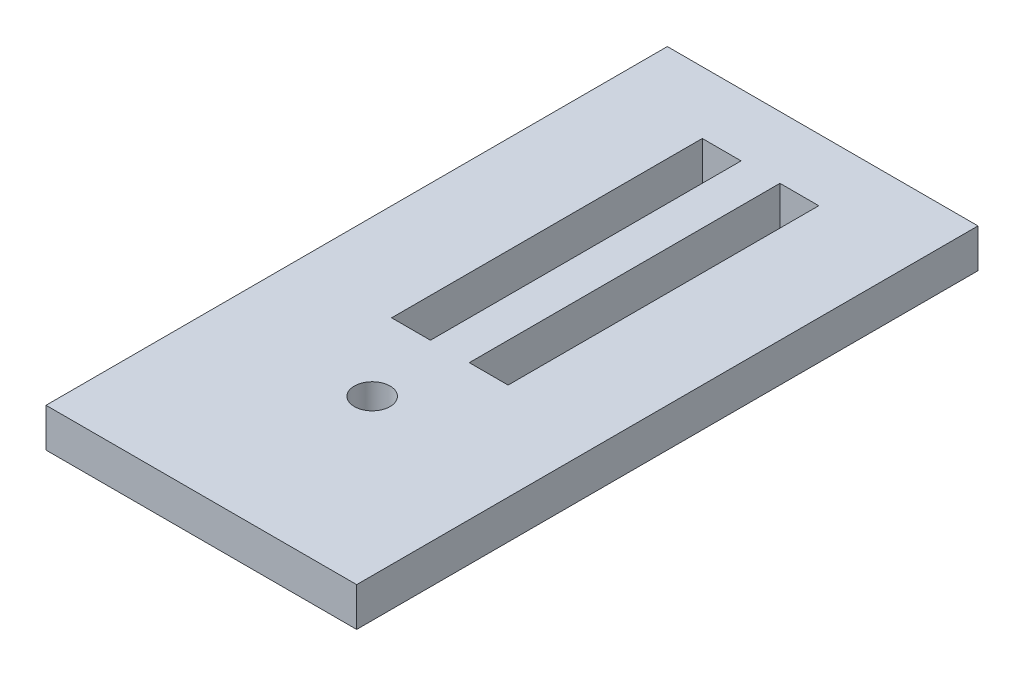
ISO-10303-21;
HEADER;
FILE_DESCRIPTION(('STEP AP214'),'2;1');
FILE_NAME('part.step','',(''),(''),'','','');
FILE_SCHEMA(('AUTOMOTIVE_DESIGN { 1 0 10303 214 1 1 1 1 }'));
ENDSEC;
DATA;
#1=APPLICATION_CONTEXT('core data for automotive mechanical design processes');
#2=APPLICATION_PROTOCOL_DEFINITION('international standard','automotive_design',2000,#1);
#3=PRODUCT_CONTEXT('',#1,'mechanical');
#4=PRODUCT('Part','Part','',(#3));
#5=PRODUCT_RELATED_PRODUCT_CATEGORY('part','',(#4));
#6=PRODUCT_DEFINITION_FORMATION('','',#4);
#7=PRODUCT_DEFINITION_CONTEXT('part definition',#1,'design');
#8=PRODUCT_DEFINITION('design','',#6,#7);
#9=PRODUCT_DEFINITION_SHAPE('','',#8);
#10=(LENGTH_UNIT() NAMED_UNIT(*) SI_UNIT(.MILLI.,.METRE.));
#11=(NAMED_UNIT(*) PLANE_ANGLE_UNIT() SI_UNIT($,.RADIAN.));
#12=(NAMED_UNIT(*) SI_UNIT($,.STERADIAN.) SOLID_ANGLE_UNIT());
#13=UNCERTAINTY_MEASURE_WITH_UNIT(LENGTH_MEASURE(1.E-05),#10,'distance_accuracy_value','');
#14=(GEOMETRIC_REPRESENTATION_CONTEXT(3) GLOBAL_UNCERTAINTY_ASSIGNED_CONTEXT((#13)) GLOBAL_UNIT_ASSIGNED_CONTEXT((#10,
#11,#12)) REPRESENTATION_CONTEXT('',''));
#15=CARTESIAN_POINT('',(0.,0.,0.));
#16=DIRECTION('',(0.,0.,1.));
#17=DIRECTION('',(1.,0.,0.));
#18=AXIS2_PLACEMENT_3D('',#15,#16,#17);
#19=CARTESIAN_POINT('',(0.,3.175,0.));
#20=DIRECTION('',(0.,-1.,0.));
#21=DIRECTION('',(0.,0.,-1.));
#22=AXIS2_PLACEMENT_3D('',#19,#20,#21);
#23=PLANE('',#22);
#24=DIRECTION('',(0.,0.,-1.));
#25=VECTOR('',#24,1.);
#26=CARTESIAN_POINT('',(11.1125,3.175,-45.72));
#27=LINE('',#26,#25);
#28=CARTESIAN_POINT('',(11.1125,3.175,-20.32));
#29=VERTEX_POINT('',#28);
#30=CARTESIAN_POINT('',(11.1125,3.175,-45.72));
#31=VERTEX_POINT('',#30);
#32=EDGE_CURVE('E186',#29,#31,#27,.T.);
#33=ORIENTED_EDGE('',*,*,#32,.F.);
#34=DIRECTION('',(1.,0.,0.));
#35=VECTOR('',#34,1.);
#36=CARTESIAN_POINT('',(11.1125,3.175,-20.32));
#37=LINE('',#36,#35);
#38=CARTESIAN_POINT('',(7.9375,3.175,-20.32));
#39=VERTEX_POINT('',#38);
#40=EDGE_CURVE('E197',#39,#29,#37,.T.);
#41=ORIENTED_EDGE('',*,*,#40,.F.);
#42=DIRECTION('',(0.,0.,1.));
#43=VECTOR('',#42,1.);
#44=CARTESIAN_POINT('',(7.93750000000001,3.175,-45.72));
#45=LINE('',#44,#43);
#46=CARTESIAN_POINT('',(7.93750000000001,3.175,-45.72));
#47=VERTEX_POINT('',#46);
#48=EDGE_CURVE('E193',#47,#39,#45,.T.);
#49=ORIENTED_EDGE('',*,*,#48,.F.);
#50=DIRECTION('',(-1.,0.,0.));
#51=VECTOR('',#50,1.);
#52=CARTESIAN_POINT('',(11.1125,3.175,-45.72));
#53=LINE('',#52,#51);
#54=EDGE_CURVE('E189',#31,#47,#53,.T.);
#55=ORIENTED_EDGE('',*,*,#54,.F.);
#56=EDGE_LOOP('',(#33,#41,#49,#55));
#57=FACE_BOUND('',#56,.T.);
#58=DIRECTION('',(0.,0.,1.));
#59=VECTOR('',#58,1.);
#60=CARTESIAN_POINT('',(0.,3.175,0.));
#61=LINE('',#60,#59);
#62=CARTESIAN_POINT('',(0.,3.175,-50.8));
#63=VERTEX_POINT('',#62);
#64=CARTESIAN_POINT('',(0.,3.175,0.));
#65=VERTEX_POINT('',#64);
#66=EDGE_CURVE('E229',#63,#65,#61,.T.);
#67=ORIENTED_EDGE('',*,*,#66,.T.);
#68=DIRECTION('',(1.,0.,0.));
#69=VECTOR('',#68,1.);
#70=CARTESIAN_POINT('',(0.,3.175,0.));
#71=LINE('',#70,#69);
#72=CARTESIAN_POINT('',(25.4,3.175,0.));
#73=VERTEX_POINT('',#72);
#74=EDGE_CURVE('E233',#65,#73,#71,.T.);
#75=ORIENTED_EDGE('',*,*,#74,.T.);
#76=DIRECTION('',(0.,0.,-1.));
#77=VECTOR('',#76,1.);
#78=CARTESIAN_POINT('',(25.4,3.175,0.));
#79=LINE('',#78,#77);
#80=CARTESIAN_POINT('',(25.4,3.175,-50.8));
#81=VERTEX_POINT('',#80);
#82=EDGE_CURVE('E237',#73,#81,#79,.T.);
#83=ORIENTED_EDGE('',*,*,#82,.T.);
#84=DIRECTION('',(-1.,0.,0.));
#85=VECTOR('',#84,1.);
#86=CARTESIAN_POINT('',(0.,3.175,-50.8));
#87=LINE('',#86,#85);
#88=EDGE_CURVE('E240',#81,#63,#87,.T.);
#89=ORIENTED_EDGE('',*,*,#88,.T.);
#90=EDGE_LOOP('',(#67,#75,#83,#89));
#91=FACE_BOUND('',#90,.T.);
#92=DIRECTION('',(-1.,0.,0.));
#93=VECTOR('',#92,1.);
#94=CARTESIAN_POINT('',(14.2875,3.175,-45.72));
#95=LINE('',#94,#93);
#96=CARTESIAN_POINT('',(17.4625,3.175,-45.72));
#97=VERTEX_POINT('',#96);
#98=CARTESIAN_POINT('',(14.2875,3.175,-45.72));
#99=VERTEX_POINT('',#98);
#100=EDGE_CURVE('E135',#97,#99,#95,.T.);
#101=ORIENTED_EDGE('',*,*,#100,.F.);
#102=DIRECTION('',(0.,0.,-1.));
#103=VECTOR('',#102,1.);
#104=CARTESIAN_POINT('',(17.4625,3.175,-45.72));
#105=LINE('',#104,#103);
#106=CARTESIAN_POINT('',(17.4625,3.175,-20.32));
#107=VERTEX_POINT('',#106);
#108=EDGE_CURVE('E162',#107,#97,#105,.T.);
#109=ORIENTED_EDGE('',*,*,#108,.F.);
#110=DIRECTION('',(1.,0.,0.));
#111=VECTOR('',#110,1.);
#112=CARTESIAN_POINT('',(14.2875,3.175,-20.32));
#113=LINE('',#112,#111);
#114=CARTESIAN_POINT('',(14.2875,3.175,-20.32));
#115=VERTEX_POINT('',#114);
#116=EDGE_CURVE('E158',#115,#107,#113,.T.);
#117=ORIENTED_EDGE('',*,*,#116,.F.);
#118=DIRECTION('',(0.,0.,1.));
#119=VECTOR('',#118,1.);
#120=CARTESIAN_POINT('',(14.2875,3.175,-45.72));
#121=LINE('',#120,#119);
#122=EDGE_CURVE('E144',#99,#115,#121,.T.);
#123=ORIENTED_EDGE('',*,*,#122,.F.);
#124=EDGE_LOOP('',(#101,#109,#117,#123));
#125=FACE_BOUND('',#124,.T.);
#126=CARTESIAN_POINT('',(12.7,3.175,-13.97));
#127=DIRECTION('',(0.,1.,0.));
#128=DIRECTION('',(0.,0.,1.));
#129=AXIS2_PLACEMENT_3D('',#126,#127,#128);
#130=CIRCLE('',#129,1.4605);
#131=CARTESIAN_POINT('',(12.7,3.175,-12.5095));
#132=VERTEX_POINT('',#131);
#133=EDGE_CURVE('E170',#132,#132,#130,.T.);
#134=ORIENTED_EDGE('',*,*,#133,.F.);
#135=EDGE_LOOP('',(#134));
#136=FACE_BOUND('',#135,.T.);
#137=ADVANCED_FACE('F45',(#57,#91,#125,#136),#23,.F.);
#138=CARTESIAN_POINT('',(0.,0.,0.));
#139=DIRECTION('',(0.,-1.,0.));
#140=DIRECTION('',(0.,0.,-1.));
#141=AXIS2_PLACEMENT_3D('',#138,#139,#140);
#142=PLANE('',#141);
#143=DIRECTION('',(0.,0.,-1.));
#144=VECTOR('',#143,1.);
#145=CARTESIAN_POINT('',(17.4625,0.,-45.72));
#146=LINE('',#145,#144);
#147=CARTESIAN_POINT('',(17.4625,0.,-20.32));
#148=VERTEX_POINT('',#147);
#149=CARTESIAN_POINT('',(17.4625,0.,-45.72));
#150=VERTEX_POINT('',#149);
#151=EDGE_CURVE('E145',#148,#150,#146,.T.);
#152=ORIENTED_EDGE('',*,*,#151,.T.);
#153=DIRECTION('',(-1.,0.,0.));
#154=VECTOR('',#153,1.);
#155=CARTESIAN_POINT('',(14.2875,0.,-45.72));
#156=LINE('',#155,#154);
#157=CARTESIAN_POINT('',(14.2875,0.,-45.72));
#158=VERTEX_POINT('',#157);
#159=EDGE_CURVE('E69',#150,#158,#156,.T.);
#160=ORIENTED_EDGE('',*,*,#159,.T.);
#161=DIRECTION('',(0.,0.,1.));
#162=VECTOR('',#161,1.);
#163=CARTESIAN_POINT('',(14.2875,0.,-45.72));
#164=LINE('',#163,#162);
#165=CARTESIAN_POINT('',(14.2875,0.,-20.32));
#166=VERTEX_POINT('',#165);
#167=EDGE_CURVE('E151',#158,#166,#164,.T.);
#168=ORIENTED_EDGE('',*,*,#167,.T.);
#169=DIRECTION('',(1.,0.,0.));
#170=VECTOR('',#169,1.);
#171=CARTESIAN_POINT('',(14.2875,0.,-20.32));
#172=LINE('',#171,#170);
#173=EDGE_CURVE('E173',#166,#148,#172,.T.);
#174=ORIENTED_EDGE('',*,*,#173,.T.);
#175=EDGE_LOOP('',(#152,#160,#168,#174));
#176=FACE_BOUND('',#175,.T.);
#177=DIRECTION('',(1.,0.,0.));
#178=VECTOR('',#177,1.);
#179=CARTESIAN_POINT('',(11.1125,0.,-20.32));
#180=LINE('',#179,#178);
#181=CARTESIAN_POINT('',(7.9375,0.,-20.32));
#182=VERTEX_POINT('',#181);
#183=CARTESIAN_POINT('',(11.1125,0.,-20.32));
#184=VERTEX_POINT('',#183);
#185=EDGE_CURVE('E190',#182,#184,#180,.T.);
#186=ORIENTED_EDGE('',*,*,#185,.T.);
#187=DIRECTION('',(0.,0.,-1.));
#188=VECTOR('',#187,1.);
#189=CARTESIAN_POINT('',(11.1125,0.,-45.72));
#190=LINE('',#189,#188);
#191=CARTESIAN_POINT('',(11.1125,0.,-45.72));
#192=VERTEX_POINT('',#191);
#193=EDGE_CURVE('E153',#184,#192,#190,.T.);
#194=ORIENTED_EDGE('',*,*,#193,.T.);
#195=DIRECTION('',(-1.,0.,0.));
#196=VECTOR('',#195,1.);
#197=CARTESIAN_POINT('',(11.1125,0.,-45.72));
#198=LINE('',#197,#196);
#199=CARTESIAN_POINT('',(7.93750000000001,0.,-45.72));
#200=VERTEX_POINT('',#199);
#201=EDGE_CURVE('E204',#192,#200,#198,.T.);
#202=ORIENTED_EDGE('',*,*,#201,.T.);
#203=DIRECTION('',(0.,0.,1.));
#204=VECTOR('',#203,1.);
#205=CARTESIAN_POINT('',(7.93750000000001,0.,-45.72));
#206=LINE('',#205,#204);
#207=EDGE_CURVE('E208',#200,#182,#206,.T.);
#208=ORIENTED_EDGE('',*,*,#207,.T.);
#209=EDGE_LOOP('',(#186,#194,#202,#208));
#210=FACE_BOUND('',#209,.T.);
#211=DIRECTION('',(0.,0.,1.));
#212=VECTOR('',#211,1.);
#213=CARTESIAN_POINT('',(0.,0.,0.));
#214=LINE('',#213,#212);
#215=CARTESIAN_POINT('',(0.,0.,-50.8));
#216=VERTEX_POINT('',#215);
#217=CARTESIAN_POINT('',(0.,0.,0.));
#218=VERTEX_POINT('',#217);
#219=EDGE_CURVE('E228',#216,#218,#214,.T.);
#220=ORIENTED_EDGE('',*,*,#219,.F.);
#221=DIRECTION('',(-1.,0.,0.));
#222=VECTOR('',#221,1.);
#223=CARTESIAN_POINT('',(0.,0.,-50.8));
#224=LINE('',#223,#222);
#225=CARTESIAN_POINT('',(25.4,0.,-50.8));
#226=VERTEX_POINT('',#225);
#227=EDGE_CURVE('E234',#226,#216,#224,.T.);
#228=ORIENTED_EDGE('',*,*,#227,.F.);
#229=DIRECTION('',(0.,0.,-1.));
#230=VECTOR('',#229,1.);
#231=CARTESIAN_POINT('',(25.4,0.,0.));
#232=LINE('',#231,#230);
#233=CARTESIAN_POINT('',(25.4,0.,0.));
#234=VERTEX_POINT('',#233);
#235=EDGE_CURVE('E250',#234,#226,#232,.T.);
#236=ORIENTED_EDGE('',*,*,#235,.F.);
#237=DIRECTION('',(1.,0.,0.));
#238=VECTOR('',#237,1.);
#239=CARTESIAN_POINT('',(0.,0.,0.));
#240=LINE('',#239,#238);
#241=EDGE_CURVE('E247',#218,#234,#240,.T.);
#242=ORIENTED_EDGE('',*,*,#241,.F.);
#243=EDGE_LOOP('',(#220,#228,#236,#242));
#244=FACE_BOUND('',#243,.T.);
#245=CARTESIAN_POINT('',(12.7,0.,-13.97));
#246=DIRECTION('',(0.,1.,0.));
#247=DIRECTION('',(0.,0.,1.));
#248=AXIS2_PLACEMENT_3D('',#245,#246,#247);
#249=CIRCLE('',#248,1.4605);
#250=CARTESIAN_POINT('',(12.7,0.,-12.5095));
#251=VERTEX_POINT('',#250);
#252=EDGE_CURVE('E354',#251,#251,#249,.T.);
#253=ORIENTED_EDGE('',*,*,#252,.T.);
#254=EDGE_LOOP('',(#253));
#255=FACE_BOUND('',#254,.T.);
#256=ADVANCED_FACE('F273',(#176,#210,#244,#255),#142,.T.);
#257=CARTESIAN_POINT('',(0.,3.175,0.));
#258=DIRECTION('',(1.,0.,0.));
#259=DIRECTION('',(0.,0.,-1.));
#260=AXIS2_PLACEMENT_3D('',#257,#258,#259);
#261=PLANE('',#260);
#262=ORIENTED_EDGE('',*,*,#219,.T.);
#263=DIRECTION('',(0.,-1.,0.));
#264=VECTOR('',#263,1.);
#265=CARTESIAN_POINT('',(0.,3.175,0.));
#266=LINE('',#265,#264);
#267=EDGE_CURVE('E11',#65,#218,#266,.T.);
#268=ORIENTED_EDGE('',*,*,#267,.F.);
#269=ORIENTED_EDGE('',*,*,#66,.F.);
#270=DIRECTION('',(0.,-1.,0.));
#271=VECTOR('',#270,1.);
#272=CARTESIAN_POINT('',(0.,3.175,-50.8));
#273=LINE('',#272,#271);
#274=EDGE_CURVE('E243',#63,#216,#273,.T.);
#275=ORIENTED_EDGE('',*,*,#274,.T.);
#276=EDGE_LOOP('',(#262,#268,#269,#275));
#277=FACE_BOUND('',#276,.T.);
#278=ADVANCED_FACE('F47',(#277),#261,.F.);
#279=CARTESIAN_POINT('',(0.,3.175,0.));
#280=DIRECTION('',(0.,0.,-1.));
#281=DIRECTION('',(-1.,0.,0.));
#282=AXIS2_PLACEMENT_3D('',#279,#280,#281);
#283=PLANE('',#282);
#284=ORIENTED_EDGE('',*,*,#241,.T.);
#285=DIRECTION('',(0.,-1.,0.));
#286=VECTOR('',#285,1.);
#287=CARTESIAN_POINT('',(25.4,3.175,0.));
#288=LINE('',#287,#286);
#289=EDGE_CURVE('E54',#73,#234,#288,.T.);
#290=ORIENTED_EDGE('',*,*,#289,.F.);
#291=ORIENTED_EDGE('',*,*,#74,.F.);
#292=ORIENTED_EDGE('',*,*,#267,.T.);
#293=EDGE_LOOP('',(#284,#290,#291,#292));
#294=FACE_BOUND('',#293,.T.);
#295=ADVANCED_FACE('F283',(#294),#283,.F.);
#296=CARTESIAN_POINT('',(25.4,3.175,0.));
#297=DIRECTION('',(-1.,0.,0.));
#298=DIRECTION('',(0.,0.,1.));
#299=AXIS2_PLACEMENT_3D('',#296,#297,#298);
#300=PLANE('',#299);
#301=ORIENTED_EDGE('',*,*,#235,.T.);
#302=DIRECTION('',(0.,-1.,0.));
#303=VECTOR('',#302,1.);
#304=CARTESIAN_POINT('',(25.4,3.175,-50.8));
#305=LINE('',#304,#303);
#306=EDGE_CURVE('E258',#81,#226,#305,.T.);
#307=ORIENTED_EDGE('',*,*,#306,.F.);
#308=ORIENTED_EDGE('',*,*,#82,.F.);
#309=ORIENTED_EDGE('',*,*,#289,.T.);
#310=EDGE_LOOP('',(#301,#307,#308,#309));
#311=FACE_BOUND('',#310,.T.);
#312=ADVANCED_FACE('F267',(#311),#300,.F.);
#313=CARTESIAN_POINT('',(0.,3.175,-50.8));
#314=DIRECTION('',(0.,0.,1.));
#315=DIRECTION('',(1.,0.,0.));
#316=AXIS2_PLACEMENT_3D('',#313,#314,#315);
#317=PLANE('',#316);
#318=ORIENTED_EDGE('',*,*,#227,.T.);
#319=ORIENTED_EDGE('',*,*,#274,.F.);
#320=ORIENTED_EDGE('',*,*,#88,.F.);
#321=ORIENTED_EDGE('',*,*,#306,.T.);
#322=EDGE_LOOP('',(#318,#319,#320,#321));
#323=FACE_BOUND('',#322,.T.);
#324=ADVANCED_FACE('F277',(#323),#317,.F.);
#325=CARTESIAN_POINT('',(11.1125,3.175,-45.72));
#326=DIRECTION('',(-1.,0.,0.));
#327=DIRECTION('',(0.,0.,1.));
#328=AXIS2_PLACEMENT_3D('',#325,#326,#327);
#329=PLANE('',#328);
#330=ORIENTED_EDGE('',*,*,#193,.F.);
#331=DIRECTION('',(0.,-1.,0.));
#332=VECTOR('',#331,1.);
#333=CARTESIAN_POINT('',(11.1125,3.175,-20.32));
#334=LINE('',#333,#332);
#335=EDGE_CURVE('E200',#29,#184,#334,.T.);
#336=ORIENTED_EDGE('',*,*,#335,.F.);
#337=ORIENTED_EDGE('',*,*,#32,.T.);
#338=DIRECTION('',(0.,-1.,0.));
#339=VECTOR('',#338,1.);
#340=CARTESIAN_POINT('',(11.1125,3.175,-45.72));
#341=LINE('',#340,#339);
#342=EDGE_CURVE('E224',#31,#192,#341,.T.);
#343=ORIENTED_EDGE('',*,*,#342,.T.);
#344=EDGE_LOOP('',(#330,#336,#337,#343));
#345=FACE_BOUND('',#344,.T.);
#346=ADVANCED_FACE('F300',(#345),#329,.T.);
#347=CARTESIAN_POINT('',(11.1125,3.175,-45.72));
#348=DIRECTION('',(0.,0.,1.));
#349=DIRECTION('',(1.,0.,0.));
#350=AXIS2_PLACEMENT_3D('',#347,#348,#349);
#351=PLANE('',#350);
#352=ORIENTED_EDGE('',*,*,#201,.F.);
#353=ORIENTED_EDGE('',*,*,#342,.F.);
#354=ORIENTED_EDGE('',*,*,#54,.T.);
#355=DIRECTION('',(0.,-1.,0.));
#356=VECTOR('',#355,1.);
#357=CARTESIAN_POINT('',(7.93750000000001,3.175,-45.72));
#358=LINE('',#357,#356);
#359=EDGE_CURVE('E221',#47,#200,#358,.T.);
#360=ORIENTED_EDGE('',*,*,#359,.T.);
#361=EDGE_LOOP('',(#352,#353,#354,#360));
#362=FACE_BOUND('',#361,.T.);
#363=ADVANCED_FACE('F307',(#362),#351,.T.);
#364=CARTESIAN_POINT('',(7.93750000000001,3.175,-45.72));
#365=DIRECTION('',(1.,0.,0.));
#366=DIRECTION('',(0.,0.,-1.));
#367=AXIS2_PLACEMENT_3D('',#364,#365,#366);
#368=PLANE('',#367);
#369=ORIENTED_EDGE('',*,*,#207,.F.);
#370=ORIENTED_EDGE('',*,*,#359,.F.);
#371=ORIENTED_EDGE('',*,*,#48,.T.);
#372=DIRECTION('',(0.,-1.,0.));
#373=VECTOR('',#372,1.);
#374=CARTESIAN_POINT('',(7.9375,3.175,-20.32));
#375=LINE('',#374,#373);
#376=EDGE_CURVE('E218',#39,#182,#375,.T.);
#377=ORIENTED_EDGE('',*,*,#376,.T.);
#378=EDGE_LOOP('',(#369,#370,#371,#377));
#379=FACE_BOUND('',#378,.T.);
#380=ADVANCED_FACE('F312',(#379),#368,.T.);
#381=CARTESIAN_POINT('',(11.1125,3.175,-20.32));
#382=DIRECTION('',(0.,0.,-1.));
#383=DIRECTION('',(-1.,0.,0.));
#384=AXIS2_PLACEMENT_3D('',#381,#382,#383);
#385=PLANE('',#384);
#386=ORIENTED_EDGE('',*,*,#185,.F.);
#387=ORIENTED_EDGE('',*,*,#376,.F.);
#388=ORIENTED_EDGE('',*,*,#40,.T.);
#389=ORIENTED_EDGE('',*,*,#335,.T.);
#390=EDGE_LOOP('',(#386,#387,#388,#389));
#391=FACE_BOUND('',#390,.T.);
#392=ADVANCED_FACE('F319',(#391),#385,.T.);
#393=CARTESIAN_POINT('',(14.2875,3.175,-45.72));
#394=DIRECTION('',(0.,0.,1.));
#395=DIRECTION('',(1.,0.,0.));
#396=AXIS2_PLACEMENT_3D('',#393,#394,#395);
#397=PLANE('',#396);
#398=ORIENTED_EDGE('',*,*,#159,.F.);
#399=DIRECTION('',(0.,-1.,0.));
#400=VECTOR('',#399,1.);
#401=CARTESIAN_POINT('',(17.4625,3.175,-45.72));
#402=LINE('',#401,#400);
#403=EDGE_CURVE('E139',#97,#150,#402,.T.);
#404=ORIENTED_EDGE('',*,*,#403,.F.);
#405=ORIENTED_EDGE('',*,*,#100,.T.);
#406=DIRECTION('',(0.,-1.,0.));
#407=VECTOR('',#406,1.);
#408=CARTESIAN_POINT('',(14.2875,3.175,-45.72));
#409=LINE('',#408,#407);
#410=EDGE_CURVE('E138',#99,#158,#409,.T.);
#411=ORIENTED_EDGE('',*,*,#410,.T.);
#412=EDGE_LOOP('',(#398,#404,#405,#411));
#413=FACE_BOUND('',#412,.T.);
#414=ADVANCED_FACE('F137',(#413),#397,.T.);
#415=CARTESIAN_POINT('',(14.2875,3.175,-45.72));
#416=DIRECTION('',(1.,0.,0.));
#417=DIRECTION('',(0.,0.,-1.));
#418=AXIS2_PLACEMENT_3D('',#415,#416,#417);
#419=PLANE('',#418);
#420=ORIENTED_EDGE('',*,*,#167,.F.);
#421=ORIENTED_EDGE('',*,*,#410,.F.);
#422=ORIENTED_EDGE('',*,*,#122,.T.);
#423=DIRECTION('',(0.,-1.,0.));
#424=VECTOR('',#423,1.);
#425=CARTESIAN_POINT('',(14.2875,3.175,-20.32));
#426=LINE('',#425,#424);
#427=EDGE_CURVE('E154',#115,#166,#426,.T.);
#428=ORIENTED_EDGE('',*,*,#427,.T.);
#429=EDGE_LOOP('',(#420,#421,#422,#428));
#430=FACE_BOUND('',#429,.T.);
#431=ADVANCED_FACE('F148',(#430),#419,.T.);
#432=CARTESIAN_POINT('',(14.2875,3.175,-20.32));
#433=DIRECTION('',(0.,0.,-1.));
#434=DIRECTION('',(-1.,0.,0.));
#435=AXIS2_PLACEMENT_3D('',#432,#433,#434);
#436=PLANE('',#435);
#437=ORIENTED_EDGE('',*,*,#173,.F.);
#438=ORIENTED_EDGE('',*,*,#427,.F.);
#439=ORIENTED_EDGE('',*,*,#116,.T.);
#440=DIRECTION('',(0.,-1.,0.));
#441=VECTOR('',#440,1.);
#442=CARTESIAN_POINT('',(17.4625,3.175,-20.32));
#443=LINE('',#442,#441);
#444=EDGE_CURVE('E61',#107,#148,#443,.T.);
#445=ORIENTED_EDGE('',*,*,#444,.T.);
#446=EDGE_LOOP('',(#437,#438,#439,#445));
#447=FACE_BOUND('',#446,.T.);
#448=ADVANCED_FACE('F337',(#447),#436,.T.);
#449=CARTESIAN_POINT('',(17.4625,3.175,-45.72));
#450=DIRECTION('',(-1.,0.,0.));
#451=DIRECTION('',(0.,0.,1.));
#452=AXIS2_PLACEMENT_3D('',#449,#450,#451);
#453=PLANE('',#452);
#454=ORIENTED_EDGE('',*,*,#151,.F.);
#455=ORIENTED_EDGE('',*,*,#444,.F.);
#456=ORIENTED_EDGE('',*,*,#108,.T.);
#457=ORIENTED_EDGE('',*,*,#403,.T.);
#458=EDGE_LOOP('',(#454,#455,#456,#457));
#459=FACE_BOUND('',#458,.T.);
#460=ADVANCED_FACE('F340',(#459),#453,.T.);
#461=CARTESIAN_POINT('',(12.7,3.175,-13.97));
#462=DIRECTION('',(0.,-1.,0.));
#463=DIRECTION('',(0.,0.,-1.));
#464=AXIS2_PLACEMENT_3D('',#461,#462,#463);
#465=CYLINDRICAL_SURFACE('',#464,1.4605);
#466=ORIENTED_EDGE('',*,*,#133,.T.);
#467=EDGE_LOOP('',(#466));
#468=FACE_BOUND('',#467,.T.);
#469=ORIENTED_EDGE('',*,*,#252,.F.);
#470=EDGE_LOOP('',(#469));
#471=FACE_BOUND('',#470,.T.);
#472=ADVANCED_FACE('F344',(#468,#471),#465,.F.);
#473=CLOSED_SHELL('',(#137,#256,#278,#295,#312,#324,#346,#363,#380,#392,#414,#431,#448,#460,#472));
#474=MANIFOLD_SOLID_BREP('B2',#473);
#475=ADVANCED_BREP_SHAPE_REPRESENTATION('',(#18,#474),#14);
#476=SHAPE_DEFINITION_REPRESENTATION(#9,#475);
ENDSEC;
END-ISO-10303-21;
